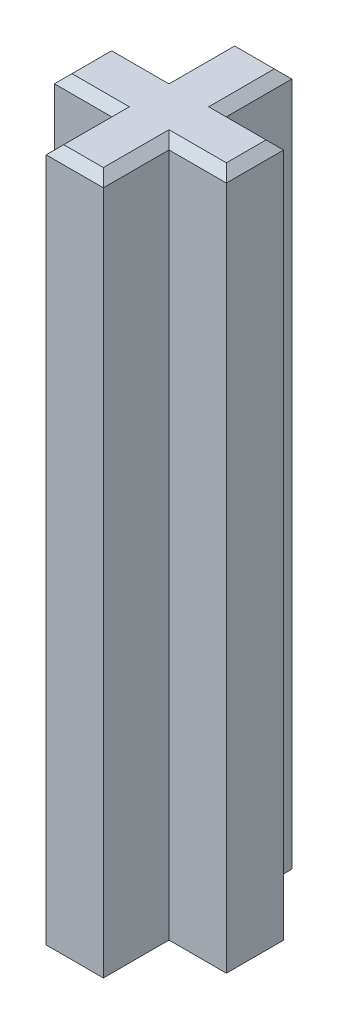
ISO-10303-21;
HEADER;
FILE_DESCRIPTION(('STEP AP214'),'2;1');
FILE_NAME('part.step','',(''),(''),'','','');
FILE_SCHEMA(('AUTOMOTIVE_DESIGN { 1 0 10303 214 1 1 1 1 }'));
ENDSEC;
DATA;
#1=APPLICATION_CONTEXT('core data for automotive mechanical design processes');
#2=APPLICATION_PROTOCOL_DEFINITION('international standard','automotive_design',2000,#1);
#3=PRODUCT_CONTEXT('',#1,'mechanical');
#4=PRODUCT('Part','Part','',(#3));
#5=PRODUCT_RELATED_PRODUCT_CATEGORY('part','',(#4));
#6=PRODUCT_DEFINITION_FORMATION('','',#4);
#7=PRODUCT_DEFINITION_CONTEXT('part definition',#1,'design');
#8=PRODUCT_DEFINITION('design','',#6,#7);
#9=PRODUCT_DEFINITION_SHAPE('','',#8);
#10=(LENGTH_UNIT() NAMED_UNIT(*) SI_UNIT(.MILLI.,.METRE.));
#11=(NAMED_UNIT(*) PLANE_ANGLE_UNIT() SI_UNIT($,.RADIAN.));
#12=(NAMED_UNIT(*) SI_UNIT($,.STERADIAN.) SOLID_ANGLE_UNIT());
#13=UNCERTAINTY_MEASURE_WITH_UNIT(LENGTH_MEASURE(1.E-05),#10,'distance_accuracy_value','');
#14=(GEOMETRIC_REPRESENTATION_CONTEXT(3) GLOBAL_UNCERTAINTY_ASSIGNED_CONTEXT((#13)) GLOBAL_UNIT_ASSIGNED_CONTEXT((#10,
#11,#12)) REPRESENTATION_CONTEXT('',''));
#15=CARTESIAN_POINT('',(0.,0.,0.));
#16=DIRECTION('',(0.,0.,1.));
#17=DIRECTION('',(1.,0.,0.));
#18=AXIS2_PLACEMENT_3D('',#15,#16,#17);
#19=CARTESIAN_POINT('',(-1.635,20.,0.));
#20=DIRECTION('',(1.,0.,0.));
#21=DIRECTION('',(0.,0.,-1.));
#22=AXIS2_PLACEMENT_3D('',#19,#20,#21);
#23=PLANE('',#22);
#24=DIRECTION('',(0.,-1.,0.));
#25=VECTOR('',#24,1.);
#26=CARTESIAN_POINT('',(-1.635,20.,-3.5));
#27=LINE('',#26,#25);
#28=CARTESIAN_POINT('',(-1.635,19.75,-3.5));
#29=VERTEX_POINT('',#28);
#30=CARTESIAN_POINT('',(-1.635,0.25,-3.5));
#31=VERTEX_POINT('',#30);
#32=EDGE_CURVE('E203',#29,#31,#27,.T.);
#33=ORIENTED_EDGE('',*,*,#32,.T.);
#34=DIRECTION('',(0.,0.,1.));
#35=VECTOR('',#34,1.);
#36=CARTESIAN_POINT('',(-1.635,0.25,0.));
#37=LINE('',#36,#35);
#38=CARTESIAN_POINT('',(-1.635,0.25,-1.87));
#39=VERTEX_POINT('',#38);
#40=EDGE_CURVE('E11',#31,#39,#37,.T.);
#41=ORIENTED_EDGE('',*,*,#40,.T.);
#42=DIRECTION('',(0.,-1.,0.));
#43=VECTOR('',#42,1.);
#44=CARTESIAN_POINT('',(-1.635,20.,-1.87));
#45=LINE('',#44,#43);
#46=CARTESIAN_POINT('',(-1.635,19.75,-1.87));
#47=VERTEX_POINT('',#46);
#48=EDGE_CURVE('E206',#47,#39,#45,.T.);
#49=ORIENTED_EDGE('',*,*,#48,.F.);
#50=DIRECTION('',(0.,0.,-1.));
#51=VECTOR('',#50,1.);
#52=CARTESIAN_POINT('',(-1.635,19.75,-3.5));
#53=LINE('',#52,#51);
#54=EDGE_CURVE('E202',#47,#29,#53,.T.);
#55=ORIENTED_EDGE('',*,*,#54,.T.);
#56=EDGE_LOOP('',(#33,#41,#49,#55));
#57=FACE_BOUND('',#56,.T.);
#58=ADVANCED_FACE('F37',(#57),#23,.F.);
#59=CARTESIAN_POINT('',(0.,20.,-1.87));
#60=DIRECTION('',(0.,0.,-1.));
#61=DIRECTION('',(-1.,0.,0.));
#62=AXIS2_PLACEMENT_3D('',#59,#60,#61);
#63=PLANE('',#62);
#64=ORIENTED_EDGE('',*,*,#48,.T.);
#65=DIRECTION('',(1.,0.,0.));
#66=VECTOR('',#65,1.);
#67=CARTESIAN_POINT('',(0.,0.25,-1.87));
#68=LINE('',#67,#66);
#69=CARTESIAN_POINT('',(0.,0.25,-1.87));
#70=VERTEX_POINT('',#69);
#71=EDGE_CURVE('E211',#39,#70,#68,.T.);
#72=ORIENTED_EDGE('',*,*,#71,.T.);
#73=DIRECTION('',(0.,-1.,0.));
#74=VECTOR('',#73,1.);
#75=CARTESIAN_POINT('',(0.,20.,-1.87));
#76=LINE('',#75,#74);
#77=CARTESIAN_POINT('',(0.,19.75,-1.87));
#78=VERTEX_POINT('',#77);
#79=EDGE_CURVE('E237',#78,#70,#76,.T.);
#80=ORIENTED_EDGE('',*,*,#79,.F.);
#81=DIRECTION('',(-1.,0.,0.));
#82=VECTOR('',#81,1.);
#83=CARTESIAN_POINT('',(-1.635,19.75,-1.87));
#84=LINE('',#83,#82);
#85=EDGE_CURVE('E212',#78,#47,#84,.T.);
#86=ORIENTED_EDGE('',*,*,#85,.T.);
#87=EDGE_LOOP('',(#64,#72,#80,#86));
#88=FACE_BOUND('',#87,.T.);
#89=ADVANCED_FACE('F419',(#88),#63,.F.);
#90=CARTESIAN_POINT('',(0.,20.,0.));
#91=DIRECTION('',(-1.,0.,0.));
#92=DIRECTION('',(0.,0.,1.));
#93=AXIS2_PLACEMENT_3D('',#90,#91,#92);
#94=PLANE('',#93);
#95=ORIENTED_EDGE('',*,*,#79,.T.);
#96=DIRECTION('',(0.,0.,1.));
#97=VECTOR('',#96,1.);
#98=CARTESIAN_POINT('',(0.,0.25,0.));
#99=LINE('',#98,#97);
#100=CARTESIAN_POINT('',(0.,0.25,0.));
#101=VERTEX_POINT('',#100);
#102=EDGE_CURVE('E336',#70,#101,#99,.T.);
#103=ORIENTED_EDGE('',*,*,#102,.T.);
#104=DIRECTION('',(0.,-1.,0.));
#105=VECTOR('',#104,1.);
#106=CARTESIAN_POINT('',(0.,20.,0.));
#107=LINE('',#106,#105);
#108=CARTESIAN_POINT('',(0.,19.75,0.));
#109=VERTEX_POINT('',#108);
#110=EDGE_CURVE('E499',#109,#101,#107,.T.);
#111=ORIENTED_EDGE('',*,*,#110,.F.);
#112=DIRECTION('',(0.,0.,-1.));
#113=VECTOR('',#112,1.);
#114=CARTESIAN_POINT('',(0.,19.75,0.));
#115=LINE('',#114,#113);
#116=EDGE_CURVE('E278',#109,#78,#115,.T.);
#117=ORIENTED_EDGE('',*,*,#116,.T.);
#118=EDGE_LOOP('',(#95,#103,#111,#117));
#119=FACE_BOUND('',#118,.T.);
#120=ADVANCED_FACE('F502',(#119),#94,.T.);
#121=CARTESIAN_POINT('',(0.,20.,0.));
#122=DIRECTION('',(0.,0.,-1.));
#123=DIRECTION('',(-1.,0.,0.));
#124=AXIS2_PLACEMENT_3D('',#121,#122,#123);
#125=PLANE('',#124);
#126=ORIENTED_EDGE('',*,*,#110,.T.);
#127=DIRECTION('',(1.,0.,0.));
#128=VECTOR('',#127,1.);
#129=CARTESIAN_POINT('',(0.,0.25,0.));
#130=LINE('',#129,#128);
#131=CARTESIAN_POINT('',(1.63,0.25,0.));
#132=VERTEX_POINT('',#131);
#133=EDGE_CURVE('E338',#101,#132,#130,.T.);
#134=ORIENTED_EDGE('',*,*,#133,.T.);
#135=DIRECTION('',(0.,-1.,0.));
#136=VECTOR('',#135,1.);
#137=CARTESIAN_POINT('',(1.63,20.,0.));
#138=LINE('',#137,#136);
#139=CARTESIAN_POINT('',(1.63,19.75,0.));
#140=VERTEX_POINT('',#139);
#141=EDGE_CURVE('E496',#140,#132,#138,.T.);
#142=ORIENTED_EDGE('',*,*,#141,.F.);
#143=DIRECTION('',(-1.,0.,0.));
#144=VECTOR('',#143,1.);
#145=CARTESIAN_POINT('',(0.,19.75,0.));
#146=LINE('',#145,#144);
#147=EDGE_CURVE('E276',#140,#109,#146,.T.);
#148=ORIENTED_EDGE('',*,*,#147,.T.);
#149=EDGE_LOOP('',(#126,#134,#142,#148));
#150=FACE_BOUND('',#149,.T.);
#151=ADVANCED_FACE('F507',(#150),#125,.F.);
#152=CARTESIAN_POINT('',(1.63,20.,0.));
#153=DIRECTION('',(-1.,0.,0.));
#154=DIRECTION('',(0.,0.,1.));
#155=AXIS2_PLACEMENT_3D('',#152,#153,#154);
#156=PLANE('',#155);
#157=ORIENTED_EDGE('',*,*,#141,.T.);
#158=DIRECTION('',(0.,0.,-1.));
#159=VECTOR('',#158,1.);
#160=CARTESIAN_POINT('',(1.63,0.25,0.));
#161=LINE('',#160,#159);
#162=CARTESIAN_POINT('',(1.63,0.25,-1.87));
#163=VERTEX_POINT('',#162);
#164=EDGE_CURVE('E340',#132,#163,#161,.T.);
#165=ORIENTED_EDGE('',*,*,#164,.T.);
#166=DIRECTION('',(0.,-1.,0.));
#167=VECTOR('',#166,1.);
#168=CARTESIAN_POINT('',(1.63,20.,-1.87));
#169=LINE('',#168,#167);
#170=CARTESIAN_POINT('',(1.63,19.75,-1.87));
#171=VERTEX_POINT('',#170);
#172=EDGE_CURVE('E493',#171,#163,#169,.T.);
#173=ORIENTED_EDGE('',*,*,#172,.F.);
#174=DIRECTION('',(0.,0.,1.));
#175=VECTOR('',#174,1.);
#176=CARTESIAN_POINT('',(1.63,19.75,0.));
#177=LINE('',#176,#175);
#178=EDGE_CURVE('E274',#171,#140,#177,.T.);
#179=ORIENTED_EDGE('',*,*,#178,.T.);
#180=EDGE_LOOP('',(#157,#165,#173,#179));
#181=FACE_BOUND('',#180,.T.);
#182=ADVANCED_FACE('F625',(#181),#156,.F.);
#183=CARTESIAN_POINT('',(0.,20.,-1.87));
#184=DIRECTION('',(0.,0.,-1.));
#185=DIRECTION('',(-1.,0.,0.));
#186=AXIS2_PLACEMENT_3D('',#183,#184,#185);
#187=PLANE('',#186);
#188=ORIENTED_EDGE('',*,*,#172,.T.);
#189=DIRECTION('',(1.,0.,0.));
#190=VECTOR('',#189,1.);
#191=CARTESIAN_POINT('',(0.,0.25,-1.87));
#192=LINE('',#191,#190);
#193=CARTESIAN_POINT('',(3.265,0.25,-1.87));
#194=VERTEX_POINT('',#193);
#195=EDGE_CURVE('E342',#163,#194,#192,.T.);
#196=ORIENTED_EDGE('',*,*,#195,.T.);
#197=DIRECTION('',(0.,-1.,0.));
#198=VECTOR('',#197,1.);
#199=CARTESIAN_POINT('',(3.265,20.,-1.87));
#200=LINE('',#199,#198);
#201=CARTESIAN_POINT('',(3.265,19.75,-1.87));
#202=VERTEX_POINT('',#201);
#203=EDGE_CURVE('E490',#202,#194,#200,.T.);
#204=ORIENTED_EDGE('',*,*,#203,.F.);
#205=DIRECTION('',(-1.,0.,0.));
#206=VECTOR('',#205,1.);
#207=CARTESIAN_POINT('',(1.63,19.75,-1.87));
#208=LINE('',#207,#206);
#209=EDGE_CURVE('E272',#202,#171,#208,.T.);
#210=ORIENTED_EDGE('',*,*,#209,.T.);
#211=EDGE_LOOP('',(#188,#196,#204,#210));
#212=FACE_BOUND('',#211,.T.);
#213=ADVANCED_FACE('F621',(#212),#187,.F.);
#214=CARTESIAN_POINT('',(3.265,20.,0.));
#215=DIRECTION('',(1.,0.,0.));
#216=DIRECTION('',(0.,0.,-1.));
#217=AXIS2_PLACEMENT_3D('',#214,#215,#216);
#218=PLANE('',#217);
#219=ORIENTED_EDGE('',*,*,#203,.T.);
#220=DIRECTION('',(0.,0.,-1.));
#221=VECTOR('',#220,1.);
#222=CARTESIAN_POINT('',(3.265,0.25,-3.5));
#223=LINE('',#222,#221);
#224=CARTESIAN_POINT('',(3.265,0.25,-3.5));
#225=VERTEX_POINT('',#224);
#226=EDGE_CURVE('E344',#194,#225,#223,.T.);
#227=ORIENTED_EDGE('',*,*,#226,.T.);
#228=DIRECTION('',(0.,-1.,0.));
#229=VECTOR('',#228,1.);
#230=CARTESIAN_POINT('',(3.265,20.,-3.5));
#231=LINE('',#230,#229);
#232=CARTESIAN_POINT('',(3.265,19.75,-3.5));
#233=VERTEX_POINT('',#232);
#234=EDGE_CURVE('E487',#233,#225,#231,.T.);
#235=ORIENTED_EDGE('',*,*,#234,.F.);
#236=DIRECTION('',(0.,0.,1.));
#237=VECTOR('',#236,1.);
#238=CARTESIAN_POINT('',(3.265,19.75,0.));
#239=LINE('',#238,#237);
#240=EDGE_CURVE('E270',#233,#202,#239,.T.);
#241=ORIENTED_EDGE('',*,*,#240,.T.);
#242=EDGE_LOOP('',(#219,#227,#235,#241));
#243=FACE_BOUND('',#242,.T.);
#244=ADVANCED_FACE('F617',(#243),#218,.T.);
#245=CARTESIAN_POINT('',(0.,20.,-3.5));
#246=DIRECTION('',(0.,0.,-1.));
#247=DIRECTION('',(-1.,0.,0.));
#248=AXIS2_PLACEMENT_3D('',#245,#246,#247);
#249=PLANE('',#248);
#250=ORIENTED_EDGE('',*,*,#234,.T.);
#251=DIRECTION('',(-1.,0.,0.));
#252=VECTOR('',#251,1.);
#253=CARTESIAN_POINT('',(1.63,0.25,-3.5));
#254=LINE('',#253,#252);
#255=CARTESIAN_POINT('',(1.63,0.25,-3.5));
#256=VERTEX_POINT('',#255);
#257=EDGE_CURVE('E346',#225,#256,#254,.T.);
#258=ORIENTED_EDGE('',*,*,#257,.T.);
#259=DIRECTION('',(0.,-1.,0.));
#260=VECTOR('',#259,1.);
#261=CARTESIAN_POINT('',(1.63,20.,-3.5));
#262=LINE('',#261,#260);
#263=CARTESIAN_POINT('',(1.63,19.75,-3.5));
#264=VERTEX_POINT('',#263);
#265=EDGE_CURVE('E481',#264,#256,#262,.T.);
#266=ORIENTED_EDGE('',*,*,#265,.F.);
#267=DIRECTION('',(1.,0.,0.));
#268=VECTOR('',#267,1.);
#269=CARTESIAN_POINT('',(0.,19.75,-3.5));
#270=LINE('',#269,#268);
#271=EDGE_CURVE('E268',#264,#233,#270,.T.);
#272=ORIENTED_EDGE('',*,*,#271,.T.);
#273=EDGE_LOOP('',(#250,#258,#266,#272));
#274=FACE_BOUND('',#273,.T.);
#275=ADVANCED_FACE('F613',(#274),#249,.T.);
#276=CARTESIAN_POINT('',(1.63,20.,0.));
#277=DIRECTION('',(-1.,0.,0.));
#278=DIRECTION('',(0.,0.,1.));
#279=AXIS2_PLACEMENT_3D('',#276,#277,#278);
#280=PLANE('',#279);
#281=ORIENTED_EDGE('',*,*,#265,.T.);
#282=DIRECTION('',(0.,0.,-1.));
#283=VECTOR('',#282,1.);
#284=CARTESIAN_POINT('',(1.63,0.25,0.));
#285=LINE('',#284,#283);
#286=CARTESIAN_POINT('',(1.63,0.25,-5.37));
#287=VERTEX_POINT('',#286);
#288=EDGE_CURVE('E348',#256,#287,#285,.T.);
#289=ORIENTED_EDGE('',*,*,#288,.T.);
#290=DIRECTION('',(0.,-1.,0.));
#291=VECTOR('',#290,1.);
#292=CARTESIAN_POINT('',(1.63,20.,-5.37));
#293=LINE('',#292,#291);
#294=CARTESIAN_POINT('',(1.63,19.75,-5.37));
#295=VERTEX_POINT('',#294);
#296=EDGE_CURVE('E479',#295,#287,#293,.T.);
#297=ORIENTED_EDGE('',*,*,#296,.F.);
#298=DIRECTION('',(0.,0.,1.));
#299=VECTOR('',#298,1.);
#300=CARTESIAN_POINT('',(1.63,19.75,-3.5));
#301=LINE('',#300,#299);
#302=EDGE_CURVE('E266',#295,#264,#301,.T.);
#303=ORIENTED_EDGE('',*,*,#302,.T.);
#304=EDGE_LOOP('',(#281,#289,#297,#303));
#305=FACE_BOUND('',#304,.T.);
#306=ADVANCED_FACE('F610',(#305),#280,.F.);
#307=CARTESIAN_POINT('',(0.,20.,-5.37));
#308=DIRECTION('',(0.,0.,-1.));
#309=DIRECTION('',(-1.,0.,0.));
#310=AXIS2_PLACEMENT_3D('',#307,#308,#309);
#311=PLANE('',#310);
#312=ORIENTED_EDGE('',*,*,#296,.T.);
#313=DIRECTION('',(-1.,0.,0.));
#314=VECTOR('',#313,1.);
#315=CARTESIAN_POINT('',(0.,0.25,-5.37));
#316=LINE('',#315,#314);
#317=CARTESIAN_POINT('',(0.,0.25,-5.37));
#318=VERTEX_POINT('',#317);
#319=EDGE_CURVE('E350',#287,#318,#316,.T.);
#320=ORIENTED_EDGE('',*,*,#319,.T.);
#321=DIRECTION('',(0.,-1.,0.));
#322=VECTOR('',#321,1.);
#323=CARTESIAN_POINT('',(0.,20.,-5.37));
#324=LINE('',#323,#322);
#325=CARTESIAN_POINT('',(0.,19.75,-5.37));
#326=VERTEX_POINT('',#325);
#327=EDGE_CURVE('E474',#326,#318,#324,.T.);
#328=ORIENTED_EDGE('',*,*,#327,.F.);
#329=DIRECTION('',(1.,0.,0.));
#330=VECTOR('',#329,1.);
#331=CARTESIAN_POINT('',(0.,19.75,-5.37));
#332=LINE('',#331,#330);
#333=EDGE_CURVE('E264',#326,#295,#332,.T.);
#334=ORIENTED_EDGE('',*,*,#333,.T.);
#335=EDGE_LOOP('',(#312,#320,#328,#334));
#336=FACE_BOUND('',#335,.T.);
#337=ADVANCED_FACE('F477',(#336),#311,.T.);
#338=CARTESIAN_POINT('',(0.,20.,0.));
#339=DIRECTION('',(-1.,0.,0.));
#340=DIRECTION('',(0.,0.,1.));
#341=AXIS2_PLACEMENT_3D('',#338,#339,#340);
#342=PLANE('',#341);
#343=ORIENTED_EDGE('',*,*,#327,.T.);
#344=DIRECTION('',(0.,0.,1.));
#345=VECTOR('',#344,1.);
#346=CARTESIAN_POINT('',(0.,0.25,-3.5));
#347=LINE('',#346,#345);
#348=CARTESIAN_POINT('',(0.,0.25,-3.5));
#349=VERTEX_POINT('',#348);
#350=EDGE_CURVE('E62',#318,#349,#347,.T.);
#351=ORIENTED_EDGE('',*,*,#350,.T.);
#352=DIRECTION('',(0.,-1.,0.));
#353=VECTOR('',#352,1.);
#354=CARTESIAN_POINT('',(0.,20.,-3.5));
#355=LINE('',#354,#353);
#356=CARTESIAN_POINT('',(0.,19.75,-3.5));
#357=VERTEX_POINT('',#356);
#358=EDGE_CURVE('E218',#357,#349,#355,.T.);
#359=ORIENTED_EDGE('',*,*,#358,.F.);
#360=DIRECTION('',(0.,0.,-1.));
#361=VECTOR('',#360,1.);
#362=CARTESIAN_POINT('',(0.,19.75,0.));
#363=LINE('',#362,#361);
#364=EDGE_CURVE('E262',#357,#326,#363,.T.);
#365=ORIENTED_EDGE('',*,*,#364,.T.);
#366=EDGE_LOOP('',(#343,#351,#359,#365));
#367=FACE_BOUND('',#366,.T.);
#368=ADVANCED_FACE('F473',(#367),#342,.T.);
#369=CARTESIAN_POINT('',(0.,20.,-3.5));
#370=DIRECTION('',(0.,0.,-1.));
#371=DIRECTION('',(-1.,0.,0.));
#372=AXIS2_PLACEMENT_3D('',#369,#370,#371);
#373=PLANE('',#372);
#374=ORIENTED_EDGE('',*,*,#358,.T.);
#375=DIRECTION('',(-1.,0.,0.));
#376=VECTOR('',#375,1.);
#377=CARTESIAN_POINT('',(-1.635,0.25,-3.5));
#378=LINE('',#377,#376);
#379=EDGE_CURVE('E47',#349,#31,#378,.T.);
#380=ORIENTED_EDGE('',*,*,#379,.T.);
#381=ORIENTED_EDGE('',*,*,#32,.F.);
#382=DIRECTION('',(1.,0.,0.));
#383=VECTOR('',#382,1.);
#384=CARTESIAN_POINT('',(0.,19.75,-3.5));
#385=LINE('',#384,#383);
#386=EDGE_CURVE('E217',#29,#357,#385,.T.);
#387=ORIENTED_EDGE('',*,*,#386,.T.);
#388=EDGE_LOOP('',(#374,#380,#381,#387));
#389=FACE_BOUND('',#388,.T.);
#390=ADVANCED_FACE('F215',(#389),#373,.T.);
#391=CARTESIAN_POINT('',(0.,20.,0.));
#392=DIRECTION('',(0.,1.,0.));
#393=DIRECTION('',(0.,0.,1.));
#394=AXIS2_PLACEMENT_3D('',#391,#392,#393);
#395=PLANE('',#394);
#396=DIRECTION('',(0.,0.,1.));
#397=VECTOR('',#396,1.);
#398=CARTESIAN_POINT('',(0.25,20.,0.));
#399=LINE('',#398,#397);
#400=CARTESIAN_POINT('',(0.25,20.,-5.12));
#401=VERTEX_POINT('',#400);
#402=CARTESIAN_POINT('',(0.25,20.,-3.25));
#403=VERTEX_POINT('',#402);
#404=EDGE_CURVE('E258',#401,#403,#399,.T.);
#405=ORIENTED_EDGE('',*,*,#404,.T.);
#406=DIRECTION('',(-1.,0.,0.));
#407=VECTOR('',#406,1.);
#408=CARTESIAN_POINT('',(0.,20.,-3.25));
#409=LINE('',#408,#407);
#410=CARTESIAN_POINT('',(-1.385,20.,-3.25));
#411=VERTEX_POINT('',#410);
#412=EDGE_CURVE('E260',#403,#411,#409,.T.);
#413=ORIENTED_EDGE('',*,*,#412,.T.);
#414=DIRECTION('',(0.,0.,1.));
#415=VECTOR('',#414,1.);
#416=CARTESIAN_POINT('',(-1.385,20.,-1.87));
#417=LINE('',#416,#415);
#418=CARTESIAN_POINT('',(-1.385,20.,-2.12));
#419=VERTEX_POINT('',#418);
#420=EDGE_CURVE('E224',#411,#419,#417,.T.);
#421=ORIENTED_EDGE('',*,*,#420,.T.);
#422=DIRECTION('',(1.,0.,0.));
#423=VECTOR('',#422,1.);
#424=CARTESIAN_POINT('',(0.,20.,-2.12));
#425=LINE('',#424,#423);
#426=CARTESIAN_POINT('',(0.25,20.,-2.12));
#427=VERTEX_POINT('',#426);
#428=EDGE_CURVE('E235',#419,#427,#425,.T.);
#429=ORIENTED_EDGE('',*,*,#428,.T.);
#430=DIRECTION('',(0.,0.,1.));
#431=VECTOR('',#430,1.);
#432=CARTESIAN_POINT('',(0.25,20.,0.));
#433=LINE('',#432,#431);
#434=CARTESIAN_POINT('',(0.25,20.,-0.25));
#435=VERTEX_POINT('',#434);
#436=EDGE_CURVE('E242',#427,#435,#433,.T.);
#437=ORIENTED_EDGE('',*,*,#436,.T.);
#438=DIRECTION('',(1.,0.,0.));
#439=VECTOR('',#438,1.);
#440=CARTESIAN_POINT('',(1.63,20.,-0.25));
#441=LINE('',#440,#439);
#442=CARTESIAN_POINT('',(1.38,20.,-0.25));
#443=VERTEX_POINT('',#442);
#444=EDGE_CURVE('E244',#435,#443,#441,.T.);
#445=ORIENTED_EDGE('',*,*,#444,.T.);
#446=DIRECTION('',(0.,0.,-1.));
#447=VECTOR('',#446,1.);
#448=CARTESIAN_POINT('',(1.38,20.,-1.87));
#449=LINE('',#448,#447);
#450=CARTESIAN_POINT('',(1.38,20.,-2.12));
#451=VERTEX_POINT('',#450);
#452=EDGE_CURVE('E246',#443,#451,#449,.T.);
#453=ORIENTED_EDGE('',*,*,#452,.T.);
#454=DIRECTION('',(1.,0.,0.));
#455=VECTOR('',#454,1.);
#456=CARTESIAN_POINT('',(3.265,20.,-2.12));
#457=LINE('',#456,#455);
#458=CARTESIAN_POINT('',(3.015,20.,-2.12));
#459=VERTEX_POINT('',#458);
#460=EDGE_CURVE('E248',#451,#459,#457,.T.);
#461=ORIENTED_EDGE('',*,*,#460,.T.);
#462=DIRECTION('',(0.,0.,-1.));
#463=VECTOR('',#462,1.);
#464=CARTESIAN_POINT('',(3.015,20.,0.));
#465=LINE('',#464,#463);
#466=CARTESIAN_POINT('',(3.015,20.,-3.25));
#467=VERTEX_POINT('',#466);
#468=EDGE_CURVE('E250',#459,#467,#465,.T.);
#469=ORIENTED_EDGE('',*,*,#468,.T.);
#470=DIRECTION('',(-1.,0.,0.));
#471=VECTOR('',#470,1.);
#472=CARTESIAN_POINT('',(0.,20.,-3.25));
#473=LINE('',#472,#471);
#474=CARTESIAN_POINT('',(1.38,20.,-3.25));
#475=VERTEX_POINT('',#474);
#476=EDGE_CURVE('E252',#467,#475,#473,.T.);
#477=ORIENTED_EDGE('',*,*,#476,.T.);
#478=DIRECTION('',(0.,0.,-1.));
#479=VECTOR('',#478,1.);
#480=CARTESIAN_POINT('',(1.38,20.,-5.37));
#481=LINE('',#480,#479);
#482=CARTESIAN_POINT('',(1.38,20.,-5.12));
#483=VERTEX_POINT('',#482);
#484=EDGE_CURVE('E254',#475,#483,#481,.T.);
#485=ORIENTED_EDGE('',*,*,#484,.T.);
#486=DIRECTION('',(-1.,0.,0.));
#487=VECTOR('',#486,1.);
#488=CARTESIAN_POINT('',(0.,20.,-5.12));
#489=LINE('',#488,#487);
#490=EDGE_CURVE('E256',#483,#401,#489,.T.);
#491=ORIENTED_EDGE('',*,*,#490,.T.);
#492=EDGE_LOOP('',(#405,#413,#421,#429,#437,#445,#453,#461,#469,#477,#485,#491));
#493=FACE_BOUND('',#492,.T.);
#494=ADVANCED_FACE('F429',(#493),#395,.T.);
#495=CARTESIAN_POINT('',(0.,0.,0.));
#496=DIRECTION('',(0.,1.,0.));
#497=DIRECTION('',(0.,0.,1.));
#498=AXIS2_PLACEMENT_3D('',#495,#496,#497);
#499=PLANE('',#498);
#500=DIRECTION('',(0.,0.,-1.));
#501=VECTOR('',#500,1.);
#502=CARTESIAN_POINT('',(0.249999999999999,0.,-1.87));
#503=LINE('',#502,#501);
#504=CARTESIAN_POINT('',(0.249999999999999,0.,-0.249999999999999));
#505=VERTEX_POINT('',#504);
#506=CARTESIAN_POINT('',(0.249999999999999,0.,-2.12));
#507=VERTEX_POINT('',#506);
#508=EDGE_CURVE('E331',#505,#507,#503,.T.);
#509=ORIENTED_EDGE('',*,*,#508,.T.);
#510=DIRECTION('',(-1.,0.,0.));
#511=VECTOR('',#510,1.);
#512=CARTESIAN_POINT('',(0.,0.,-2.12));
#513=LINE('',#512,#511);
#514=CARTESIAN_POINT('',(-1.385,0.,-2.12));
#515=VERTEX_POINT('',#514);
#516=EDGE_CURVE('E333',#507,#515,#513,.T.);
#517=ORIENTED_EDGE('',*,*,#516,.T.);
#518=DIRECTION('',(0.,0.,-1.));
#519=VECTOR('',#518,1.);
#520=CARTESIAN_POINT('',(-1.385,0.,0.));
#521=LINE('',#520,#519);
#522=CARTESIAN_POINT('',(-1.385,0.,-3.25));
#523=VERTEX_POINT('',#522);
#524=EDGE_CURVE('E311',#515,#523,#521,.T.);
#525=ORIENTED_EDGE('',*,*,#524,.T.);
#526=DIRECTION('',(1.,0.,0.));
#527=VECTOR('',#526,1.);
#528=CARTESIAN_POINT('',(0.,0.,-3.25));
#529=LINE('',#528,#527);
#530=CARTESIAN_POINT('',(0.249999999999999,0.,-3.25));
#531=VERTEX_POINT('',#530);
#532=EDGE_CURVE('E313',#523,#531,#529,.T.);
#533=ORIENTED_EDGE('',*,*,#532,.T.);
#534=DIRECTION('',(0.,0.,-1.));
#535=VECTOR('',#534,1.);
#536=CARTESIAN_POINT('',(0.249999999999999,0.,-5.37));
#537=LINE('',#536,#535);
#538=CARTESIAN_POINT('',(0.249999999999999,0.,-5.12));
#539=VERTEX_POINT('',#538);
#540=EDGE_CURVE('E315',#531,#539,#537,.T.);
#541=ORIENTED_EDGE('',*,*,#540,.T.);
#542=DIRECTION('',(1.,0.,0.));
#543=VECTOR('',#542,1.);
#544=CARTESIAN_POINT('',(1.63,0.,-5.12));
#545=LINE('',#544,#543);
#546=CARTESIAN_POINT('',(1.38,0.,-5.12));
#547=VERTEX_POINT('',#546);
#548=EDGE_CURVE('E317',#539,#547,#545,.T.);
#549=ORIENTED_EDGE('',*,*,#548,.T.);
#550=DIRECTION('',(0.,0.,1.));
#551=VECTOR('',#550,1.);
#552=CARTESIAN_POINT('',(1.38,0.,0.));
#553=LINE('',#552,#551);
#554=CARTESIAN_POINT('',(1.38,0.,-3.25));
#555=VERTEX_POINT('',#554);
#556=EDGE_CURVE('E319',#547,#555,#553,.T.);
#557=ORIENTED_EDGE('',*,*,#556,.T.);
#558=DIRECTION('',(1.,0.,0.));
#559=VECTOR('',#558,1.);
#560=CARTESIAN_POINT('',(3.265,0.,-3.25));
#561=LINE('',#560,#559);
#562=CARTESIAN_POINT('',(3.015,0.,-3.25));
#563=VERTEX_POINT('',#562);
#564=EDGE_CURVE('E321',#555,#563,#561,.T.);
#565=ORIENTED_EDGE('',*,*,#564,.T.);
#566=DIRECTION('',(0.,0.,1.));
#567=VECTOR('',#566,1.);
#568=CARTESIAN_POINT('',(3.015,0.,-1.87));
#569=LINE('',#568,#567);
#570=CARTESIAN_POINT('',(3.015,0.,-2.12));
#571=VERTEX_POINT('',#570);
#572=EDGE_CURVE('E323',#563,#571,#569,.T.);
#573=ORIENTED_EDGE('',*,*,#572,.T.);
#574=DIRECTION('',(-1.,0.,0.));
#575=VECTOR('',#574,1.);
#576=CARTESIAN_POINT('',(0.,0.,-2.12));
#577=LINE('',#576,#575);
#578=CARTESIAN_POINT('',(1.38,0.,-2.12));
#579=VERTEX_POINT('',#578);
#580=EDGE_CURVE('E325',#571,#579,#577,.T.);
#581=ORIENTED_EDGE('',*,*,#580,.T.);
#582=DIRECTION('',(0.,0.,1.));
#583=VECTOR('',#582,1.);
#584=CARTESIAN_POINT('',(1.38,0.,0.));
#585=LINE('',#584,#583);
#586=CARTESIAN_POINT('',(1.38,0.,-0.249999999999999));
#587=VERTEX_POINT('',#586);
#588=EDGE_CURVE('E327',#579,#587,#585,.T.);
#589=ORIENTED_EDGE('',*,*,#588,.T.);
#590=DIRECTION('',(-1.,0.,0.));
#591=VECTOR('',#590,1.);
#592=CARTESIAN_POINT('',(0.,0.,-0.249999999999999));
#593=LINE('',#592,#591);
#594=EDGE_CURVE('E329',#587,#505,#593,.T.);
#595=ORIENTED_EDGE('',*,*,#594,.T.);
#596=EDGE_LOOP('',(#509,#517,#525,#533,#541,#549,#557,#565,#573,#581,#589,#595));
#597=FACE_BOUND('',#596,.T.);
#598=ADVANCED_FACE('F398',(#597),#499,.F.);
#599=CARTESIAN_POINT('',(0.,20.,-2.12));
#600=DIRECTION('',(0.,0.707106781186547,0.707106781186547));
#601=DIRECTION('',(-1.,0.,0.));
#602=AXIS2_PLACEMENT_3D('',#599,#600,#601);
#603=PLANE('',#602);
#604=DIRECTION('',(0.577350269189626,-0.577350269189626,0.577350269189626));
#605=VECTOR('',#604,1.);
#606=CARTESIAN_POINT('',(2.01,21.005,-3.125));
#607=LINE('',#606,#605);
#608=EDGE_CURVE('E304',#459,#202,#607,.T.);
#609=ORIENTED_EDGE('',*,*,#608,.F.);
#610=ORIENTED_EDGE('',*,*,#460,.F.);
#611=DIRECTION('',(-0.577350269189626,0.577350269189626,-0.577350269189626));
#612=VECTOR('',#611,1.);
#613=CARTESIAN_POINT('',(0.92,20.46,-2.58));
#614=LINE('',#613,#612);
#615=EDGE_CURVE('E219',#171,#451,#614,.T.);
#616=ORIENTED_EDGE('',*,*,#615,.F.);
#617=ORIENTED_EDGE('',*,*,#209,.F.);
#618=EDGE_LOOP('',(#609,#610,#616,#617));
#619=FACE_BOUND('',#618,.T.);
#620=ADVANCED_FACE('F448',(#619),#603,.T.);
#621=CARTESIAN_POINT('',(1.38,20.,0.));
#622=DIRECTION('',(0.707106781186547,0.707106781186547,0.));
#623=DIRECTION('',(0.,0.,1.));
#624=AXIS2_PLACEMENT_3D('',#621,#622,#623);
#625=PLANE('',#624);
#626=ORIENTED_EDGE('',*,*,#615,.T.);
#627=ORIENTED_EDGE('',*,*,#452,.F.);
#628=DIRECTION('',(-0.577350269189626,0.577350269189626,-0.577350269189626));
#629=VECTOR('',#628,1.);
#630=CARTESIAN_POINT('',(0.92,20.46,-0.71));
#631=LINE('',#630,#629);
#632=EDGE_CURVE('E301',#140,#443,#631,.T.);
#633=ORIENTED_EDGE('',*,*,#632,.F.);
#634=ORIENTED_EDGE('',*,*,#178,.F.);
#635=EDGE_LOOP('',(#626,#627,#633,#634));
#636=FACE_BOUND('',#635,.T.);
#637=ADVANCED_FACE('F442',(#636),#625,.T.);
#638=CARTESIAN_POINT('',(3.265,19.75,0.));
#639=DIRECTION('',(-0.707106781186547,-0.707106781186547,0.));
#640=DIRECTION('',(0.,0.,1.));
#641=AXIS2_PLACEMENT_3D('',#638,#639,#640);
#642=PLANE('',#641);
#643=ORIENTED_EDGE('',*,*,#608,.T.);
#644=ORIENTED_EDGE('',*,*,#240,.F.);
#645=DIRECTION('',(-0.577350269189626,0.577350269189626,0.577350269189626));
#646=VECTOR('',#645,1.);
#647=CARTESIAN_POINT('',(2.09833333333333,20.9166666666667,-2.33333333333333));
#648=LINE('',#647,#646);
#649=EDGE_CURVE('E298',#467,#233,#648,.F.);
#650=ORIENTED_EDGE('',*,*,#649,.F.);
#651=ORIENTED_EDGE('',*,*,#468,.F.);
#652=EDGE_LOOP('',(#643,#644,#650,#651));
#653=FACE_BOUND('',#652,.T.);
#654=ADVANCED_FACE('F455',(#653),#642,.F.);
#655=CARTESIAN_POINT('',(0.,20.,-0.25));
#656=DIRECTION('',(0.,0.707106781186547,0.707106781186547));
#657=DIRECTION('',(-1.,0.,0.));
#658=AXIS2_PLACEMENT_3D('',#655,#656,#657);
#659=PLANE('',#658);
#660=ORIENTED_EDGE('',*,*,#632,.T.);
#661=ORIENTED_EDGE('',*,*,#444,.F.);
#662=DIRECTION('',(-0.577350269189626,-0.577350269189626,0.577350269189626));
#663=VECTOR('',#662,1.);
#664=CARTESIAN_POINT('',(0.,19.75,0.));
#665=LINE('',#664,#663);
#666=EDGE_CURVE('E295',#109,#435,#665,.F.);
#667=ORIENTED_EDGE('',*,*,#666,.F.);
#668=ORIENTED_EDGE('',*,*,#147,.F.);
#669=EDGE_LOOP('',(#660,#661,#667,#668));
#670=FACE_BOUND('',#669,.T.);
#671=ADVANCED_FACE('F437',(#670),#659,.T.);
#672=CARTESIAN_POINT('',(0.,19.75,-3.5));
#673=DIRECTION('',(0.,-0.707106781186547,0.707106781186547));
#674=DIRECTION('',(1.,0.,0.));
#675=AXIS2_PLACEMENT_3D('',#672,#673,#674);
#676=PLANE('',#675);
#677=ORIENTED_EDGE('',*,*,#649,.T.);
#678=ORIENTED_EDGE('',*,*,#271,.F.);
#679=DIRECTION('',(0.577350269189626,-0.577350269189626,-0.577350269189626));
#680=VECTOR('',#679,1.);
#681=CARTESIAN_POINT('',(0.296666666666666,21.0833333333333,-2.16666666666667));
#682=LINE('',#681,#680);
#683=EDGE_CURVE('E292',#475,#264,#682,.T.);
#684=ORIENTED_EDGE('',*,*,#683,.F.);
#685=ORIENTED_EDGE('',*,*,#476,.F.);
#686=EDGE_LOOP('',(#677,#678,#684,#685));
#687=FACE_BOUND('',#686,.T.);
#688=ADVANCED_FACE('F458',(#687),#676,.F.);
#689=CARTESIAN_POINT('',(0.,19.75,0.));
#690=DIRECTION('',(0.707106781186547,-0.707106781186547,0.));
#691=DIRECTION('',(0.,0.,-1.));
#692=AXIS2_PLACEMENT_3D('',#689,#690,#691);
#693=PLANE('',#692);
#694=ORIENTED_EDGE('',*,*,#666,.T.);
#695=ORIENTED_EDGE('',*,*,#436,.F.);
#696=DIRECTION('',(-0.577350269189626,-0.577350269189626,0.577350269189626));
#697=VECTOR('',#696,1.);
#698=CARTESIAN_POINT('',(-0.623333333333333,19.1266666666667,-1.24666666666667));
#699=LINE('',#698,#697);
#700=EDGE_CURVE('E289',#78,#427,#699,.F.);
#701=ORIENTED_EDGE('',*,*,#700,.F.);
#702=ORIENTED_EDGE('',*,*,#116,.F.);
#703=EDGE_LOOP('',(#694,#695,#701,#702));
#704=FACE_BOUND('',#703,.T.);
#705=ADVANCED_FACE('F432',(#704),#693,.F.);
#706=CARTESIAN_POINT('',(1.38,20.,0.));
#707=DIRECTION('',(0.707106781186547,0.707106781186547,0.));
#708=DIRECTION('',(0.,0.,1.));
#709=AXIS2_PLACEMENT_3D('',#706,#707,#708);
#710=PLANE('',#709);
#711=ORIENTED_EDGE('',*,*,#683,.T.);
#712=ORIENTED_EDGE('',*,*,#302,.F.);
#713=DIRECTION('',(0.577350269189626,-0.577350269189626,-0.577350269189626));
#714=VECTOR('',#713,1.);
#715=CARTESIAN_POINT('',(-0.326666666666667,21.7066666666667,-3.41333333333333));
#716=LINE('',#715,#714);
#717=EDGE_CURVE('E286',#483,#295,#716,.T.);
#718=ORIENTED_EDGE('',*,*,#717,.F.);
#719=ORIENTED_EDGE('',*,*,#484,.F.);
#720=EDGE_LOOP('',(#711,#712,#718,#719));
#721=FACE_BOUND('',#720,.T.);
#722=ADVANCED_FACE('F463',(#721),#710,.T.);
#723=CARTESIAN_POINT('',(0.,20.,-2.12));
#724=DIRECTION('',(0.,0.707106781186547,0.707106781186547));
#725=DIRECTION('',(-1.,0.,0.));
#726=AXIS2_PLACEMENT_3D('',#723,#724,#725);
#727=PLANE('',#726);
#728=ORIENTED_EDGE('',*,*,#700,.T.);
#729=ORIENTED_EDGE('',*,*,#428,.F.);
#730=DIRECTION('',(0.577350269189626,0.577350269189626,-0.577350269189626));
#731=VECTOR('',#730,1.);
#732=CARTESIAN_POINT('',(-2.09166666666667,19.2933333333333,-1.41333333333333));
#733=LINE('',#732,#731);
#734=EDGE_CURVE('E284',#47,#419,#733,.T.);
#735=ORIENTED_EDGE('',*,*,#734,.F.);
#736=ORIENTED_EDGE('',*,*,#85,.F.);
#737=EDGE_LOOP('',(#728,#729,#735,#736));
#738=FACE_BOUND('',#737,.T.);
#739=ADVANCED_FACE('F425',(#738),#727,.T.);
#740=CARTESIAN_POINT('',(0.,19.75,-5.37));
#741=DIRECTION('',(0.,-0.707106781186547,0.707106781186547));
#742=DIRECTION('',(1.,0.,0.));
#743=AXIS2_PLACEMENT_3D('',#740,#741,#742);
#744=PLANE('',#743);
#745=ORIENTED_EDGE('',*,*,#717,.T.);
#746=ORIENTED_EDGE('',*,*,#333,.F.);
#747=DIRECTION('',(0.577350269189626,0.577350269189626,0.577350269189626));
#748=VECTOR('',#747,1.);
#749=CARTESIAN_POINT('',(0.,19.75,-5.37));
#750=LINE('',#749,#748);
#751=EDGE_CURVE('E228',#401,#326,#750,.F.);
#752=ORIENTED_EDGE('',*,*,#751,.F.);
#753=ORIENTED_EDGE('',*,*,#490,.F.);
#754=EDGE_LOOP('',(#745,#746,#752,#753));
#755=FACE_BOUND('',#754,.T.);
#756=ADVANCED_FACE('F469',(#755),#744,.F.);
#757=CARTESIAN_POINT('',(-1.385,20.,0.));
#758=DIRECTION('',(-0.707106781186547,0.707106781186547,0.));
#759=DIRECTION('',(0.,0.,-1.));
#760=AXIS2_PLACEMENT_3D('',#757,#758,#759);
#761=PLANE('',#760);
#762=ORIENTED_EDGE('',*,*,#734,.T.);
#763=ORIENTED_EDGE('',*,*,#420,.F.);
#764=DIRECTION('',(0.577350269189626,0.577350269189626,0.577350269189626));
#765=VECTOR('',#764,1.);
#766=CARTESIAN_POINT('',(-0.301666666666667,21.0833333333333,-2.16666666666667));
#767=LINE('',#766,#765);
#768=EDGE_CURVE('E222',#29,#411,#767,.T.);
#769=ORIENTED_EDGE('',*,*,#768,.F.);
#770=ORIENTED_EDGE('',*,*,#54,.F.);
#771=EDGE_LOOP('',(#762,#763,#769,#770));
#772=FACE_BOUND('',#771,.T.);
#773=ADVANCED_FACE('F223',(#772),#761,.T.);
#774=CARTESIAN_POINT('',(0.,19.75,0.));
#775=DIRECTION('',(0.707106781186547,-0.707106781186547,0.));
#776=DIRECTION('',(0.,0.,-1.));
#777=AXIS2_PLACEMENT_3D('',#774,#775,#776);
#778=PLANE('',#777);
#779=ORIENTED_EDGE('',*,*,#751,.T.);
#780=ORIENTED_EDGE('',*,*,#364,.F.);
#781=DIRECTION('',(0.577350269189626,0.577350269189626,0.577350269189626));
#782=VECTOR('',#781,1.);
#783=CARTESIAN_POINT('',(0.,19.75,-3.5));
#784=LINE('',#783,#782);
#785=EDGE_CURVE('E229',#403,#357,#784,.F.);
#786=ORIENTED_EDGE('',*,*,#785,.F.);
#787=ORIENTED_EDGE('',*,*,#404,.F.);
#788=EDGE_LOOP('',(#779,#780,#786,#787));
#789=FACE_BOUND('',#788,.T.);
#790=ADVANCED_FACE('F471',(#789),#778,.F.);
#791=CARTESIAN_POINT('',(0.,19.75,-3.5));
#792=DIRECTION('',(0.,-0.707106781186547,0.707106781186547));
#793=DIRECTION('',(1.,0.,0.));
#794=AXIS2_PLACEMENT_3D('',#791,#792,#793);
#795=PLANE('',#794);
#796=ORIENTED_EDGE('',*,*,#768,.T.);
#797=ORIENTED_EDGE('',*,*,#412,.F.);
#798=ORIENTED_EDGE('',*,*,#785,.T.);
#799=ORIENTED_EDGE('',*,*,#386,.F.);
#800=EDGE_LOOP('',(#796,#797,#798,#799));
#801=FACE_BOUND('',#800,.T.);
#802=ADVANCED_FACE('F231',(#801),#795,.F.);
#803=CARTESIAN_POINT('',(0.,0.,-3.25));
#804=DIRECTION('',(0.,-0.707106781186545,-0.70710678118655));
#805=DIRECTION('',(-1.,0.,0.));
#806=AXIS2_PLACEMENT_3D('',#803,#804,#805);
#807=PLANE('',#806);
#808=DIRECTION('',(-0.577350269189625,-0.577350269189628,0.577350269189624));
#809=VECTOR('',#808,1.);
#810=CARTESIAN_POINT('',(2.01,-1.005,-2.24500000000001));
#811=LINE('',#810,#809);
#812=EDGE_CURVE('E381',#563,#225,#811,.F.);
#813=ORIENTED_EDGE('',*,*,#812,.F.);
#814=ORIENTED_EDGE('',*,*,#564,.F.);
#815=DIRECTION('',(0.577350269189624,0.577350269189628,-0.577350269189624));
#816=VECTOR('',#815,1.);
#817=CARTESIAN_POINT('',(0.920000000000003,-0.460000000000002,-2.79));
#818=LINE('',#817,#816);
#819=EDGE_CURVE('E42',#256,#555,#818,.F.);
#820=ORIENTED_EDGE('',*,*,#819,.F.);
#821=ORIENTED_EDGE('',*,*,#257,.F.);
#822=EDGE_LOOP('',(#813,#814,#820,#821));
#823=FACE_BOUND('',#822,.T.);
#824=ADVANCED_FACE('F40',(#823),#807,.T.);
#825=CARTESIAN_POINT('',(1.63,0.25,0.));
#826=DIRECTION('',(-0.70710678118655,0.707106781186545,0.));
#827=DIRECTION('',(0.,0.,-1.));
#828=AXIS2_PLACEMENT_3D('',#825,#826,#827);
#829=PLANE('',#828);
#830=ORIENTED_EDGE('',*,*,#819,.T.);
#831=ORIENTED_EDGE('',*,*,#556,.F.);
#832=DIRECTION('',(0.577350269189624,0.577350269189628,-0.577350269189624));
#833=VECTOR('',#832,1.);
#834=CARTESIAN_POINT('',(0.920000000000003,-0.460000000000002,-4.66));
#835=LINE('',#834,#833);
#836=EDGE_CURVE('E379',#287,#547,#835,.F.);
#837=ORIENTED_EDGE('',*,*,#836,.F.);
#838=ORIENTED_EDGE('',*,*,#288,.F.);
#839=EDGE_LOOP('',(#830,#831,#837,#838));
#840=FACE_BOUND('',#839,.T.);
#841=ADVANCED_FACE('F392',(#840),#829,.F.);
#842=CARTESIAN_POINT('',(3.015,0.,0.));
#843=DIRECTION('',(0.70710678118655,-0.707106781186545,0.));
#844=DIRECTION('',(0.,0.,-1.));
#845=AXIS2_PLACEMENT_3D('',#842,#843,#844);
#846=PLANE('',#845);
#847=ORIENTED_EDGE('',*,*,#812,.T.);
#848=ORIENTED_EDGE('',*,*,#226,.F.);
#849=DIRECTION('',(0.577350269189624,0.577350269189628,0.577350269189624));
#850=VECTOR('',#849,1.);
#851=CARTESIAN_POINT('',(3.72166666666666,0.706666666666668,-1.41333333333334));
#852=LINE('',#851,#850);
#853=EDGE_CURVE('E376',#571,#194,#852,.T.);
#854=ORIENTED_EDGE('',*,*,#853,.F.);
#855=ORIENTED_EDGE('',*,*,#572,.F.);
#856=EDGE_LOOP('',(#847,#848,#854,#855));
#857=FACE_BOUND('',#856,.T.);
#858=ADVANCED_FACE('F798',(#857),#846,.T.);
#859=CARTESIAN_POINT('',(0.,0.,-5.12));
#860=DIRECTION('',(0.,-0.707106781186545,-0.70710678118655));
#861=DIRECTION('',(-1.,0.,0.));
#862=AXIS2_PLACEMENT_3D('',#859,#860,#861);
#863=PLANE('',#862);
#864=ORIENTED_EDGE('',*,*,#836,.T.);
#865=ORIENTED_EDGE('',*,*,#548,.F.);
#866=DIRECTION('',(0.577350269189624,-0.577350269189628,0.577350269189624));
#867=VECTOR('',#866,1.);
#868=CARTESIAN_POINT('',(1.95666666666666,-1.70666666666667,-3.41333333333334));
#869=LINE('',#868,#867);
#870=EDGE_CURVE('E373',#318,#539,#869,.T.);
#871=ORIENTED_EDGE('',*,*,#870,.F.);
#872=ORIENTED_EDGE('',*,*,#319,.F.);
#873=EDGE_LOOP('',(#864,#865,#871,#872));
#874=FACE_BOUND('',#873,.T.);
#875=ADVANCED_FACE('F404',(#874),#863,.T.);
#876=CARTESIAN_POINT('',(0.,0.25,-1.87));
#877=DIRECTION('',(0.,0.707106781186545,-0.70710678118655));
#878=DIRECTION('',(1.,0.,0.));
#879=AXIS2_PLACEMENT_3D('',#876,#877,#878);
#880=PLANE('',#879);
#881=ORIENTED_EDGE('',*,*,#853,.T.);
#882=ORIENTED_EDGE('',*,*,#195,.F.);
#883=DIRECTION('',(-0.577350269189624,-0.577350269189628,-0.577350269189624));
#884=VECTOR('',#883,1.);
#885=CARTESIAN_POINT('',(2.25333333333333,0.873333333333335,-1.24666666666667));
#886=LINE('',#885,#884);
#887=EDGE_CURVE('E370',#579,#163,#886,.F.);
#888=ORIENTED_EDGE('',*,*,#887,.F.);
#889=ORIENTED_EDGE('',*,*,#580,.F.);
#890=EDGE_LOOP('',(#881,#882,#888,#889));
#891=FACE_BOUND('',#890,.T.);
#892=ADVANCED_FACE('F810',(#891),#880,.F.);
#893=CARTESIAN_POINT('',(0.249999999999999,0.,0.));
#894=DIRECTION('',(-0.70710678118655,-0.707106781186545,0.));
#895=DIRECTION('',(0.,0.,1.));
#896=AXIS2_PLACEMENT_3D('',#893,#894,#895);
#897=PLANE('',#896);
#898=ORIENTED_EDGE('',*,*,#870,.T.);
#899=ORIENTED_EDGE('',*,*,#540,.F.);
#900=DIRECTION('',(0.577350269189624,-0.577350269189628,0.577350269189624));
#901=VECTOR('',#900,1.);
#902=CARTESIAN_POINT('',(1.33333333333333,-1.08333333333334,-2.16666666666667));
#903=LINE('',#902,#901);
#904=EDGE_CURVE('E367',#349,#531,#903,.T.);
#905=ORIENTED_EDGE('',*,*,#904,.F.);
#906=ORIENTED_EDGE('',*,*,#350,.F.);
#907=EDGE_LOOP('',(#898,#899,#905,#906));
#908=FACE_BOUND('',#907,.T.);
#909=ADVANCED_FACE('F407',(#908),#897,.T.);
#910=CARTESIAN_POINT('',(1.63,0.25,0.));
#911=DIRECTION('',(-0.70710678118655,0.707106781186545,0.));
#912=DIRECTION('',(0.,0.,-1.));
#913=AXIS2_PLACEMENT_3D('',#910,#911,#912);
#914=PLANE('',#913);
#915=ORIENTED_EDGE('',*,*,#887,.T.);
#916=ORIENTED_EDGE('',*,*,#164,.F.);
#917=DIRECTION('',(-0.577350269189624,-0.577350269189628,-0.577350269189624));
#918=VECTOR('',#917,1.);
#919=CARTESIAN_POINT('',(1.63,0.25,0.));
#920=LINE('',#919,#918);
#921=EDGE_CURVE('E364',#587,#132,#920,.F.);
#922=ORIENTED_EDGE('',*,*,#921,.F.);
#923=ORIENTED_EDGE('',*,*,#588,.F.);
#924=EDGE_LOOP('',(#915,#916,#922,#923));
#925=FACE_BOUND('',#924,.T.);
#926=ADVANCED_FACE('F824',(#925),#914,.F.);
#927=CARTESIAN_POINT('',(0.,0.,-3.25));
#928=DIRECTION('',(0.,-0.707106781186545,-0.70710678118655));
#929=DIRECTION('',(-1.,0.,0.));
#930=AXIS2_PLACEMENT_3D('',#927,#928,#929);
#931=PLANE('',#930);
#932=ORIENTED_EDGE('',*,*,#904,.T.);
#933=ORIENTED_EDGE('',*,*,#532,.F.);
#934=DIRECTION('',(-0.577350269189625,0.577350269189628,-0.577350269189624));
#935=VECTOR('',#934,1.);
#936=CARTESIAN_POINT('',(-0.468333333333339,-0.916666666666669,-2.33333333333334));
#937=LINE('',#936,#935);
#938=EDGE_CURVE('E361',#31,#523,#937,.F.);
#939=ORIENTED_EDGE('',*,*,#938,.F.);
#940=ORIENTED_EDGE('',*,*,#379,.F.);
#941=EDGE_LOOP('',(#932,#933,#939,#940));
#942=FACE_BOUND('',#941,.T.);
#943=ADVANCED_FACE('F411',(#942),#931,.T.);
#944=CARTESIAN_POINT('',(0.,0.25,0.));
#945=DIRECTION('',(0.,0.707106781186545,-0.70710678118655));
#946=DIRECTION('',(1.,0.,0.));
#947=AXIS2_PLACEMENT_3D('',#944,#945,#946);
#948=PLANE('',#947);
#949=ORIENTED_EDGE('',*,*,#921,.T.);
#950=ORIENTED_EDGE('',*,*,#133,.F.);
#951=DIRECTION('',(-0.577350269189624,0.577350269189628,0.577350269189624));
#952=VECTOR('',#951,1.);
#953=CARTESIAN_POINT('',(0.,0.25,0.));
#954=LINE('',#953,#952);
#955=EDGE_CURVE('E358',#505,#101,#954,.T.);
#956=ORIENTED_EDGE('',*,*,#955,.F.);
#957=ORIENTED_EDGE('',*,*,#594,.F.);
#958=EDGE_LOOP('',(#949,#950,#956,#957));
#959=FACE_BOUND('',#958,.T.);
#960=ADVANCED_FACE('F511',(#959),#948,.F.);
#961=CARTESIAN_POINT('',(-1.635,0.25,0.));
#962=DIRECTION('',(0.70710678118655,0.707106781186545,0.));
#963=DIRECTION('',(0.,0.,1.));
#964=AXIS2_PLACEMENT_3D('',#961,#962,#963);
#965=PLANE('',#964);
#966=ORIENTED_EDGE('',*,*,#938,.T.);
#967=ORIENTED_EDGE('',*,*,#524,.F.);
#968=DIRECTION('',(-0.577350269189624,0.577350269189628,0.577350269189624));
#969=VECTOR('',#968,1.);
#970=CARTESIAN_POINT('',(-2.25833333333333,0.873333333333335,-1.24666666666667));
#971=LINE('',#970,#969);
#972=EDGE_CURVE('E356',#39,#515,#971,.F.);
#973=ORIENTED_EDGE('',*,*,#972,.F.);
#974=ORIENTED_EDGE('',*,*,#40,.F.);
#975=EDGE_LOOP('',(#966,#967,#973,#974));
#976=FACE_BOUND('',#975,.T.);
#977=ADVANCED_FACE('F416',(#976),#965,.F.);
#978=CARTESIAN_POINT('',(0.249999999999999,0.,0.));
#979=DIRECTION('',(-0.70710678118655,-0.707106781186545,0.));
#980=DIRECTION('',(0.,0.,1.));
#981=AXIS2_PLACEMENT_3D('',#978,#979,#980);
#982=PLANE('',#981);
#983=ORIENTED_EDGE('',*,*,#955,.T.);
#984=ORIENTED_EDGE('',*,*,#102,.F.);
#985=DIRECTION('',(-0.577350269189624,0.577350269189628,0.577350269189624));
#986=VECTOR('',#985,1.);
#987=CARTESIAN_POINT('',(0.,0.25,-1.87));
#988=LINE('',#987,#986);
#989=EDGE_CURVE('E354',#507,#70,#988,.T.);
#990=ORIENTED_EDGE('',*,*,#989,.F.);
#991=ORIENTED_EDGE('',*,*,#508,.F.);
#992=EDGE_LOOP('',(#983,#984,#990,#991));
#993=FACE_BOUND('',#992,.T.);
#994=ADVANCED_FACE('F516',(#993),#982,.T.);
#995=CARTESIAN_POINT('',(0.,0.25,-1.87));
#996=DIRECTION('',(0.,0.707106781186545,-0.70710678118655));
#997=DIRECTION('',(1.,0.,0.));
#998=AXIS2_PLACEMENT_3D('',#995,#996,#997);
#999=PLANE('',#998);
#1000=ORIENTED_EDGE('',*,*,#972,.T.);
#1001=ORIENTED_EDGE('',*,*,#516,.F.);
#1002=ORIENTED_EDGE('',*,*,#989,.T.);
#1003=ORIENTED_EDGE('',*,*,#71,.F.);
#1004=EDGE_LOOP('',(#1000,#1001,#1002,#1003));
#1005=FACE_BOUND('',#1004,.T.);
#1006=ADVANCED_FACE('F520',(#1005),#999,.F.);
#1007=CLOSED_SHELL('',(#58,#89,#120,#151,#182,#213,#244,#275,#306,#337,#368,#390,#494,#598,#620,
#637,#654,#671,#688,#705,#722,#739,#756,#773,#790,#802,#824,#841,#858,#875,#892,#909,#926,#943,
#960,#977,#994,#1006));
#1008=MANIFOLD_SOLID_BREP('B2',#1007);
#1009=ADVANCED_BREP_SHAPE_REPRESENTATION('',(#18,#1008),#14);
#1010=SHAPE_DEFINITION_REPRESENTATION(#9,#1009);
ENDSEC;
END-ISO-10303-21;
